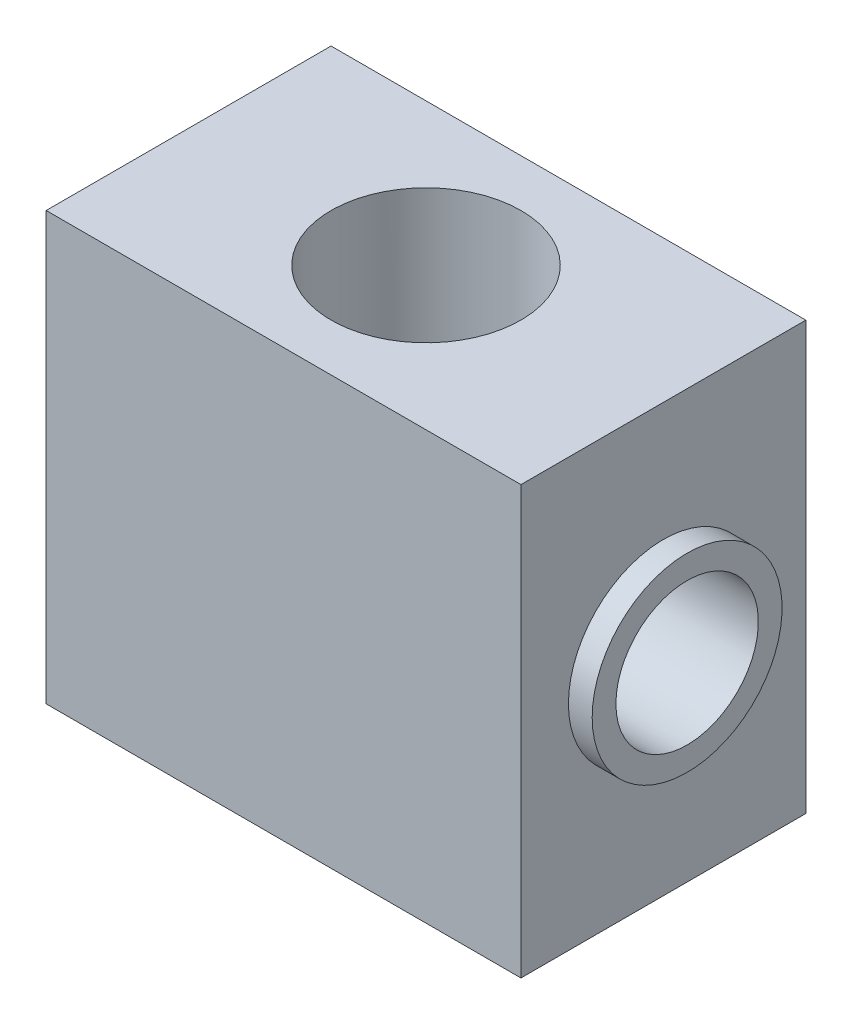
ISO-10303-21;
HEADER;
FILE_DESCRIPTION(('STEP AP214'),'2;1');
FILE_NAME('part.step','',(''),(''),'','','');
FILE_SCHEMA(('AUTOMOTIVE_DESIGN { 1 0 10303 214 1 1 1 1 }'));
ENDSEC;
DATA;
#1=APPLICATION_CONTEXT('core data for automotive mechanical design processes');
#2=APPLICATION_PROTOCOL_DEFINITION('international standard','automotive_design',2000,#1);
#3=PRODUCT_CONTEXT('',#1,'mechanical');
#4=PRODUCT('Part','Part','',(#3));
#5=PRODUCT_RELATED_PRODUCT_CATEGORY('part','',(#4));
#6=PRODUCT_DEFINITION_FORMATION('','',#4);
#7=PRODUCT_DEFINITION_CONTEXT('part definition',#1,'design');
#8=PRODUCT_DEFINITION('design','',#6,#7);
#9=PRODUCT_DEFINITION_SHAPE('','',#8);
#10=(LENGTH_UNIT() NAMED_UNIT(*) SI_UNIT(.MILLI.,.METRE.));
#11=(NAMED_UNIT(*) PLANE_ANGLE_UNIT() SI_UNIT($,.RADIAN.));
#12=(NAMED_UNIT(*) SI_UNIT($,.STERADIAN.) SOLID_ANGLE_UNIT());
#13=UNCERTAINTY_MEASURE_WITH_UNIT(LENGTH_MEASURE(1.E-05),#10,'distance_accuracy_value','');
#14=(GEOMETRIC_REPRESENTATION_CONTEXT(3) GLOBAL_UNCERTAINTY_ASSIGNED_CONTEXT((#13)) GLOBAL_UNIT_ASSIGNED_CONTEXT((#10,
#11,#12)) REPRESENTATION_CONTEXT('',''));
#15=CARTESIAN_POINT('',(0.,0.,0.));
#16=DIRECTION('',(0.,0.,1.));
#17=DIRECTION('',(1.,0.,0.));
#18=AXIS2_PLACEMENT_3D('',#15,#16,#17);
#19=CARTESIAN_POINT('',(-15.875,14.2875,9.525));
#20=DIRECTION('',(1.,0.,0.));
#21=DIRECTION('',(0.,0.,-1.));
#22=AXIS2_PLACEMENT_3D('',#19,#20,#21);
#23=PLANE('',#22);
#24=DIRECTION('',(0.,-1.,0.));
#25=VECTOR('',#24,1.);
#26=CARTESIAN_POINT('',(-15.875,14.2875,-9.525));
#27=LINE('',#26,#25);
#28=CARTESIAN_POINT('',(-15.875,14.2875,-9.525));
#29=VERTEX_POINT('',#28);
#30=CARTESIAN_POINT('',(-15.875,-14.2875,-9.525));
#31=VERTEX_POINT('',#30);
#32=EDGE_CURVE('E102',#29,#31,#27,.T.);
#33=ORIENTED_EDGE('',*,*,#32,.T.);
#34=DIRECTION('',(0.,0.,-1.));
#35=VECTOR('',#34,1.);
#36=CARTESIAN_POINT('',(-15.875,-14.2875,9.525));
#37=LINE('',#36,#35);
#38=CARTESIAN_POINT('',(-15.875,-14.2875,9.525));
#39=VERTEX_POINT('',#38);
#40=EDGE_CURVE('E44',#39,#31,#37,.T.);
#41=ORIENTED_EDGE('',*,*,#40,.F.);
#42=DIRECTION('',(0.,-1.,0.));
#43=VECTOR('',#42,1.);
#44=CARTESIAN_POINT('',(-15.875,14.2875,9.525));
#45=LINE('',#44,#43);
#46=CARTESIAN_POINT('',(-15.875,14.2875,9.525));
#47=VERTEX_POINT('',#46);
#48=EDGE_CURVE('E88',#47,#39,#45,.T.);
#49=ORIENTED_EDGE('',*,*,#48,.F.);
#50=DIRECTION('',(0.,0.,-1.));
#51=VECTOR('',#50,1.);
#52=CARTESIAN_POINT('',(-15.875,14.2875,9.525));
#53=LINE('',#52,#51);
#54=EDGE_CURVE('E98',#47,#29,#53,.T.);
#55=ORIENTED_EDGE('',*,*,#54,.T.);
#56=EDGE_LOOP('',(#33,#41,#49,#55));
#57=FACE_BOUND('',#56,.T.);
#58=CARTESIAN_POINT('',(-15.875,0.,0.));
#59=DIRECTION('',(1.,0.,0.));
#60=DIRECTION('',(0.,0.,-1.));
#61=AXIS2_PLACEMENT_3D('',#58,#59,#60);
#62=CIRCLE('',#61,6.35);
#63=CARTESIAN_POINT('',(-15.875,0.,-6.35));
#64=VERTEX_POINT('',#63);
#65=EDGE_CURVE('E11',#64,#64,#62,.F.);
#66=ORIENTED_EDGE('',*,*,#65,.F.);
#67=EDGE_LOOP('',(#66));
#68=FACE_BOUND('',#67,.T.);
#69=ADVANCED_FACE('F36',(#57,#68),#23,.F.);
#70=CARTESIAN_POINT('',(-15.875,-14.2875,9.525));
#71=DIRECTION('',(0.,1.,0.));
#72=DIRECTION('',(0.,0.,1.));
#73=AXIS2_PLACEMENT_3D('',#70,#71,#72);
#74=PLANE('',#73);
#75=CARTESIAN_POINT('',(0.,-14.2875,0.));
#76=DIRECTION('',(0.,-1.,0.));
#77=DIRECTION('',(0.,0.,-1.));
#78=AXIS2_PLACEMENT_3D('',#75,#76,#77);
#79=CIRCLE('',#78,6.35);
#80=CARTESIAN_POINT('',(0.,-14.2875,-6.35));
#81=VERTEX_POINT('',#80);
#82=EDGE_CURVE('E199',#81,#81,#79,.T.);
#83=ORIENTED_EDGE('',*,*,#82,.F.);
#84=EDGE_LOOP('',(#83));
#85=FACE_BOUND('',#84,.T.);
#86=DIRECTION('',(1.,0.,0.));
#87=VECTOR('',#86,1.);
#88=CARTESIAN_POINT('',(-15.875,-14.2875,-9.525));
#89=LINE('',#88,#87);
#90=CARTESIAN_POINT('',(15.875,-14.2875,-9.525));
#91=VERTEX_POINT('',#90);
#92=EDGE_CURVE('E93',#31,#91,#89,.T.);
#93=ORIENTED_EDGE('',*,*,#92,.T.);
#94=DIRECTION('',(0.,0.,-1.));
#95=VECTOR('',#94,1.);
#96=CARTESIAN_POINT('',(15.875,-14.2875,9.525));
#97=LINE('',#96,#95);
#98=CARTESIAN_POINT('',(15.875,-14.2875,9.525));
#99=VERTEX_POINT('',#98);
#100=EDGE_CURVE('E91',#99,#91,#97,.T.);
#101=ORIENTED_EDGE('',*,*,#100,.F.);
#102=DIRECTION('',(1.,0.,0.));
#103=VECTOR('',#102,1.);
#104=CARTESIAN_POINT('',(-15.875,-14.2875,9.525));
#105=LINE('',#104,#103);
#106=EDGE_CURVE('E83',#39,#99,#105,.T.);
#107=ORIENTED_EDGE('',*,*,#106,.F.);
#108=ORIENTED_EDGE('',*,*,#40,.T.);
#109=EDGE_LOOP('',(#93,#101,#107,#108));
#110=FACE_BOUND('',#109,.T.);
#111=ADVANCED_FACE('F92',(#85,#110),#74,.F.);
#112=CARTESIAN_POINT('',(15.875,14.2875,9.525));
#113=DIRECTION('',(-1.,0.,0.));
#114=DIRECTION('',(0.,0.,1.));
#115=AXIS2_PLACEMENT_3D('',#112,#113,#114);
#116=PLANE('',#115);
#117=CARTESIAN_POINT('',(15.875,0.,0.));
#118=DIRECTION('',(-1.,0.,0.));
#119=DIRECTION('',(0.,0.,1.));
#120=AXIS2_PLACEMENT_3D('',#117,#118,#119);
#121=CIRCLE('',#120,6.35);
#122=CARTESIAN_POINT('',(15.875,0.,6.35));
#123=VERTEX_POINT('',#122);
#124=EDGE_CURVE('E183',#123,#123,#121,.T.);
#125=ORIENTED_EDGE('',*,*,#124,.T.);
#126=EDGE_LOOP('',(#125));
#127=FACE_BOUND('',#126,.T.);
#128=DIRECTION('',(0.,1.,0.));
#129=VECTOR('',#128,1.);
#130=CARTESIAN_POINT('',(15.875,14.2875,-9.525));
#131=LINE('',#130,#129);
#132=CARTESIAN_POINT('',(15.875,14.2875,-9.525));
#133=VERTEX_POINT('',#132);
#134=EDGE_CURVE('E69',#91,#133,#131,.T.);
#135=ORIENTED_EDGE('',*,*,#134,.T.);
#136=DIRECTION('',(0.,0.,-1.));
#137=VECTOR('',#136,1.);
#138=CARTESIAN_POINT('',(15.875,14.2875,9.525));
#139=LINE('',#138,#137);
#140=CARTESIAN_POINT('',(15.875,14.2875,9.525));
#141=VERTEX_POINT('',#140);
#142=EDGE_CURVE('E94',#141,#133,#139,.T.);
#143=ORIENTED_EDGE('',*,*,#142,.F.);
#144=DIRECTION('',(0.,1.,0.));
#145=VECTOR('',#144,1.);
#146=CARTESIAN_POINT('',(15.875,14.2875,9.525));
#147=LINE('',#146,#145);
#148=EDGE_CURVE('E86',#99,#141,#147,.T.);
#149=ORIENTED_EDGE('',*,*,#148,.F.);
#150=ORIENTED_EDGE('',*,*,#100,.T.);
#151=EDGE_LOOP('',(#135,#143,#149,#150));
#152=FACE_BOUND('',#151,.T.);
#153=ADVANCED_FACE('F96',(#127,#152),#116,.F.);
#154=CARTESIAN_POINT('',(-15.875,14.2875,9.525));
#155=DIRECTION('',(0.,-1.,0.));
#156=DIRECTION('',(0.,0.,-1.));
#157=AXIS2_PLACEMENT_3D('',#154,#155,#156);
#158=PLANE('',#157);
#159=CARTESIAN_POINT('',(0.,14.2875,0.));
#160=DIRECTION('',(0.,-1.,0.));
#161=DIRECTION('',(0.,0.,-1.));
#162=AXIS2_PLACEMENT_3D('',#159,#160,#161);
#163=CIRCLE('',#162,6.35);
#164=CARTESIAN_POINT('',(0.,14.2875,-6.35));
#165=VERTEX_POINT('',#164);
#166=EDGE_CURVE('E105',#165,#165,#163,.T.);
#167=ORIENTED_EDGE('',*,*,#166,.T.);
#168=EDGE_LOOP('',(#167));
#169=FACE_BOUND('',#168,.T.);
#170=DIRECTION('',(-1.,0.,0.));
#171=VECTOR('',#170,1.);
#172=CARTESIAN_POINT('',(-15.875,14.2875,-9.525));
#173=LINE('',#172,#171);
#174=EDGE_CURVE('E75',#133,#29,#173,.T.);
#175=ORIENTED_EDGE('',*,*,#174,.T.);
#176=ORIENTED_EDGE('',*,*,#54,.F.);
#177=DIRECTION('',(-1.,0.,0.));
#178=VECTOR('',#177,1.);
#179=CARTESIAN_POINT('',(-15.875,14.2875,9.525));
#180=LINE('',#179,#178);
#181=EDGE_CURVE('E52',#141,#47,#180,.T.);
#182=ORIENTED_EDGE('',*,*,#181,.F.);
#183=ORIENTED_EDGE('',*,*,#142,.T.);
#184=EDGE_LOOP('',(#175,#176,#182,#183));
#185=FACE_BOUND('',#184,.T.);
#186=ADVANCED_FACE('F172',(#169,#185),#158,.F.);
#187=CARTESIAN_POINT('',(-15.875,-14.2875,9.525));
#188=DIRECTION('',(0.,0.,1.));
#189=DIRECTION('',(1.,0.,0.));
#190=AXIS2_PLACEMENT_3D('',#187,#188,#189);
#191=PLANE('',#190);
#192=ORIENTED_EDGE('',*,*,#48,.T.);
#193=ORIENTED_EDGE('',*,*,#106,.T.);
#194=ORIENTED_EDGE('',*,*,#148,.T.);
#195=ORIENTED_EDGE('',*,*,#181,.T.);
#196=EDGE_LOOP('',(#192,#193,#194,#195));
#197=FACE_BOUND('',#196,.T.);
#198=ADVANCED_FACE('F84',(#197),#191,.T.);
#199=CARTESIAN_POINT('',(-15.875,-14.2875,-9.525));
#200=DIRECTION('',(0.,0.,1.));
#201=DIRECTION('',(1.,0.,0.));
#202=AXIS2_PLACEMENT_3D('',#199,#200,#201);
#203=PLANE('',#202);
#204=ORIENTED_EDGE('',*,*,#32,.F.);
#205=ORIENTED_EDGE('',*,*,#174,.F.);
#206=ORIENTED_EDGE('',*,*,#134,.F.);
#207=ORIENTED_EDGE('',*,*,#92,.F.);
#208=EDGE_LOOP('',(#204,#205,#206,#207));
#209=FACE_BOUND('',#208,.T.);
#210=ADVANCED_FACE('F164',(#209),#203,.F.);
#211=CARTESIAN_POINT('',(0.,14.2875,0.));
#212=DIRECTION('',(0.,-1.,0.));
#213=DIRECTION('',(0.,0.,-1.));
#214=AXIS2_PLACEMENT_3D('',#211,#212,#213);
#215=CYLINDRICAL_SURFACE('',#214,6.35);
#216=CARTESIAN_POINT('',(4.20013020631504,0.,4.7625));
#217=CARTESIAN_POINT('',(4.20011953809576,-0.111186421407597,4.76250532818277));
#218=CARTESIAN_POINT('',(4.20456450548773,-0.222335131814892,4.75859917817128));
#219=CARTESIAN_POINT('',(4.22203936962768,-0.44345601832519,4.74310315019688));
#220=CARTESIAN_POINT('',(4.2350721306406,-0.553427789446174,4.73151070863669));
#221=CARTESIAN_POINT('',(4.26900687788614,-0.771330646695615,4.70091422775085));
#222=CARTESIAN_POINT('',(4.28992617726975,-0.879256690384536,4.68189387877689));
#223=CARTESIAN_POINT('',(4.33855272715723,-1.09210659621938,4.63686954824563));
#224=CARTESIAN_POINT('',(4.3662641495093,-1.19702856880627,4.61086127362641));
#225=CARTESIAN_POINT('',(4.45688040191758,-1.50346339809695,4.52389497913693));
#226=CARTESIAN_POINT('',(4.52785389827898,-1.69997562692512,4.45350293503279));
#227=CARTESIAN_POINT('',(4.68270372967542,-2.0775893020258,4.29038797134807));
#228=CARTESIAN_POINT('',(4.7665785048038,-2.25869260730061,4.19766775072435));
#229=CARTESIAN_POINT('',(4.95862336668685,-2.64193714688385,3.97002711682411));
#230=CARTESIAN_POINT('',(5.06820262225417,-2.8405401206498,3.83033545814133));
#231=CARTESIAN_POINT('',(5.28706206248463,-3.21479897118331,3.52211266889734));
#232=CARTESIAN_POINT('',(5.39634156245027,-3.39042037387456,3.35353906847427));
#233=CARTESIAN_POINT('',(5.56479698055828,-3.65122050637665,3.06131721347289));
#234=CARTESIAN_POINT('',(5.62662833585399,-3.74460908580083,2.94643201752262));
#235=CARTESIAN_POINT('',(5.7457293197271,-3.92129879596277,2.70683972092511));
#236=CARTESIAN_POINT('',(5.80299792145989,-4.00459765819876,2.5821304218581));
#237=CARTESIAN_POINT('',(5.9112460807229,-4.15990707700906,2.32363022931997));
#238=CARTESIAN_POINT('',(5.96223744054386,-4.23193888880663,2.18985713528875));
#239=CARTESIAN_POINT('',(6.0564698619,-4.36369664478768,1.91388198427301));
#240=CARTESIAN_POINT('',(6.09971502177246,-4.42342909879662,1.77168443778689));
#241=CARTESIAN_POINT('',(6.19228834306466,-4.55037683247,1.42208167134097));
#242=CARTESIAN_POINT('',(6.23726509319455,-4.61121835692386,1.21111732817645));
#243=CARTESIAN_POINT('',(6.30574215805104,-4.7034290276739,0.779603436911781));
#244=CARTESIAN_POINT('',(6.32926113114924,-4.73482377975149,0.559062391300457));
#245=CARTESIAN_POINT('',(6.35289761422912,-4.76637485366974,0.113878681937143));
#246=CARTESIAN_POINT('',(6.35295431750103,-4.76645000511236,-0.110773130519206));
#247=CARTESIAN_POINT('',(6.32949703102242,-4.73513918851885,-0.556630652552049));
#248=CARTESIAN_POINT('',(6.30597758276731,-4.70374593471206,-0.777835552032051));
#249=CARTESIAN_POINT('',(6.23860092463707,-4.61301727957836,-1.20297279897302));
#250=CARTESIAN_POINT('',(6.19546786487467,-4.55467571207698,-1.40723724339497));
#251=CARTESIAN_POINT('',(6.09226271662649,-4.41326428781399,-1.80238534823575));
#252=CARTESIAN_POINT('',(6.03218693475176,-4.33018903907145,-1.99326607976246));
#253=CARTESIAN_POINT('',(5.89156193328833,-4.13216689572131,-2.37876501110247));
#254=CARTESIAN_POINT('',(5.8095002345112,-4.01474300200095,-2.57155002572095));
#255=CARTESIAN_POINT('',(5.63438223787399,-3.75687658634158,-2.93549583680262));
#256=CARTESIAN_POINT('',(5.54131658988045,-3.61641444883896,-3.10663798392737));
#257=CARTESIAN_POINT('',(5.33060496833151,-3.28538856157818,-3.4578587708297));
#258=CARTESIAN_POINT('',(5.21172505327229,-3.09040452230774,-3.63307252959164));
#259=CARTESIAN_POINT('',(5.03499881699487,-2.77802581444316,-3.8705423403053));
#260=CARTESIAN_POINT('',(4.97631700019414,-2.67050395671561,-3.94551541065803));
#261=CARTESIAN_POINT('',(4.8609815056579,-2.44887753821896,-4.08676683745602));
#262=CARTESIAN_POINT('',(4.80432737690824,-2.33477445622897,-4.1530471362645));
#263=CARTESIAN_POINT('',(4.66153134894648,-2.02895557137118,-4.31394545847195));
#264=CARTESIAN_POINT('',(4.57827767321152,-1.83203549582695,-4.40145884780356));
#265=CARTESIAN_POINT('',(4.43028766387843,-1.42217341093655,-4.55039851598353));
#266=CARTESIAN_POINT('',(4.36550959205387,-1.2092689100013,-4.61188374978561));
#267=CARTESIAN_POINT('',(4.27482237642154,-0.813797574542095,-4.69589922558811));
#268=CARTESIAN_POINT('',(4.2437541642742,-0.63358114459821,-4.72373494071945));
#269=CARTESIAN_POINT('',(4.20482964993666,-0.26874576538667,-4.75842891481428));
#270=CARTESIAN_POINT('',(4.19694365066358,-0.0841327543359287,-4.76531401252016));
#271=CARTESIAN_POINT('',(4.2056964481699,0.284096895184296,-4.75758677217096));
#272=CARTESIAN_POINT('',(4.22234427194311,0.467713141950669,-4.74296652142505));
#273=CARTESIAN_POINT('',(4.27739752073682,0.828911758928113,-4.69336694467554));
#274=CARTESIAN_POINT('',(4.31584008015931,1.00648328117932,-4.65835286838308));
#275=CARTESIAN_POINT('',(4.42683729033694,1.41714942809646,-4.55338460601146));
#276=CARTESIAN_POINT('',(4.50677425640583,1.6461487693098,-4.47525785727432));
#277=CARTESIAN_POINT('',(4.63991021991195,1.97426139953277,-4.33565615732389));
#278=CARTESIAN_POINT('',(4.68656221896427,2.08119491774683,-4.28530809342367));
#279=CARTESIAN_POINT('',(4.78293813436869,2.28996762139791,-4.17746704607447));
#280=CARTESIAN_POINT('',(4.83266177306125,2.39180726579179,-4.1199747079552));
#281=CARTESIAN_POINT('',(4.98812615153396,2.69661248241161,-3.93292762354836));
#282=CARTESIAN_POINT('',(5.09688932266039,2.89121609174662,-3.79207620535673));
#283=CARTESIAN_POINT('',(5.31331307808268,3.25759996727644,-3.48237814055288));
#284=CARTESIAN_POINT('',(5.42097309960134,3.42936907192705,-3.31351789315898));
#285=CARTESIAN_POINT('',(5.58729468261059,3.6853962786035,-3.02009775640389));
#286=CARTESIAN_POINT('',(5.64867900066902,3.77764223786089,-2.90397323405847));
#287=CARTESIAN_POINT('',(5.76668806473582,3.95192632981357,-2.66194041583814));
#288=CARTESIAN_POINT('',(5.82331172939648,4.03396214537084,-2.53602990957992));
#289=CARTESIAN_POINT('',(5.93008584103535,4.18662052681659,-2.27517011196718));
#290=CARTESIAN_POINT('',(5.98024718545062,4.25726235850378,-2.14023663577307));
#291=CARTESIAN_POINT('',(6.07262368538497,4.38607734520554,-1.862050679469));
#292=CARTESIAN_POINT('',(6.11484312793146,4.44425722952752,-1.71880274245795));
#293=CARTESIAN_POINT('',(6.20451630368889,4.56698263300261,-1.36774808361083));
#294=CARTESIAN_POINT('',(6.24760807326602,4.62518728363214,-1.15652041032548));
#295=CARTESIAN_POINT('',(6.31223927466902,4.71212444937983,-0.725030721666342));
#296=CARTESIAN_POINT('',(6.33379797527245,4.74088331451683,-0.504776967342904));
#297=CARTESIAN_POINT('',(6.35360215024369,4.76731036082886,-0.0608007551086788));
#298=CARTESIAN_POINT('',(6.35179289781839,4.76490555792014,0.162928619355446));
#299=CARTESIAN_POINT('',(6.32488048738505,4.72897000008472,0.606455490129809));
#300=CARTESIAN_POINT('',(6.29977112384625,4.69543095315763,0.826251923081566));
#301=CARTESIAN_POINT('',(6.22945764617392,4.60065424513094,1.24943174497346));
#302=CARTESIAN_POINT('',(6.18485804728499,4.54024894495676,1.45310637380629));
#303=CARTESIAN_POINT('',(6.07894176373197,4.39487337110977,1.8467745664094));
#304=CARTESIAN_POINT('',(6.01762150333768,4.30989784283406,2.03676519284343));
#305=CARTESIAN_POINT('',(5.87430879455941,4.10756585394743,2.4210902699635));
#306=CARTESIAN_POINT('',(5.79076148883794,3.98763172658527,2.61347878727697));
#307=CARTESIAN_POINT('',(5.61294503234293,3.72470562365255,2.97628666156181));
#308=CARTESIAN_POINT('',(5.51866605103407,3.5816924560889,3.14668556558624));
#309=CARTESIAN_POINT('',(5.30560332844169,3.24480348935136,3.4960922146136));
#310=CARTESIAN_POINT('',(5.1856614980354,3.04646256403674,3.67013456888228));
#311=CARTESIAN_POINT('',(5.00800532024307,2.72885619017294,3.90539577865764));
#312=CARTESIAN_POINT('',(4.94912612171604,2.61956264924592,3.97955456378794));
#313=CARTESIAN_POINT('',(4.83368255810497,2.39431515772432,4.1190042180021));
#314=CARTESIAN_POINT('',(4.77711759773768,2.27836293859891,4.18429737770742));
#315=CARTESIAN_POINT('',(4.63708715636166,1.97211747298915,4.34007035191432));
#316=CARTESIAN_POINT('',(4.55655929121339,1.77695820433637,4.42383314796973));
#317=CARTESIAN_POINT('',(4.41428223500267,1.37131503495296,4.56582768375612));
#318=CARTESIAN_POINT('',(4.3524833126639,1.16087359061296,4.62412722160411));
#319=CARTESIAN_POINT('',(4.27140056615424,0.791258246769859,4.69890760336641));
#320=CARTESIAN_POINT('',(4.24496505652712,0.635130715525931,4.72263653448936));
#321=CARTESIAN_POINT('',(4.2093431933355,0.319307943541469,4.75442376689446));
#322=CARTESIAN_POINT('',(4.20014552121599,0.159615113580113,4.76249235105792));
#323=CARTESIAN_POINT('',(4.20013020631504,0.,4.7625));
#324=B_SPLINE_CURVE_WITH_KNOTS('',3,(#216,#217,#218,#219,#220,#221,#222,#223,#224,#225,#226,
#227,#228,#229,#230,#231,#232,#233,#234,#235,#236,#237,#238,#239,#240,#241,#242,#243,#244,#245,
#246,#247,#248,#249,#250,#251,#252,#253,#254,#255,#256,#257,#258,#259,#260,#261,#262,#263,#264,
#265,#266,#267,#268,#269,#270,#271,#272,#273,#274,#275,#276,#277,#278,#279,#280,#281,#282,#283,
#284,#285,#286,#287,#288,#289,#290,#291,#292,#293,#294,#295,#296,#297,#298,#299,#300,#301,#302,
#303,#304,#305,#306,#307,#308,#309,#310,#311,#312,#313,#314,#315,#316,#317,#318,#319,#320,#321,
#322,#323),.UNSPECIFIED.,.T.,.F.,(4,2,2,2,2,2,2,2,2,2,2,2,2,2,2,2,2,2,2,2,2,2,2,2,2,2,2,2,2,2,2,
2,2,2,2,2,2,2,2,2,2,2,2,2,2,2,2,2,2,2,2,2,2,4),(0.,0.333341125485964,0.666793485700833,
1.00098217018904,1.3353766362424,1.99404836638534,2.65264051837609,3.44917214298601,
4.24688525230261,4.72763995046396,5.20850253831737,5.6884467469198,6.16813627312061,
6.83742048930541,7.50612218063811,8.17655692235089,8.84714692335394,9.49476946141088,
10.1425332856933,10.8604350124544,11.5789511894263,12.4388123829923,12.869318695604,
13.2997286489051,13.9904429084842,14.6795841875462,15.2321408336656,15.7839893296708,
16.3360409239405,16.8890359561818,17.6490150530093,18.0299816062073,18.4109137723466,
19.199347122163,19.9881644534837,20.4690827237876,20.9501099376992,21.4303150693847,
21.9102602384737,22.5770676300233,23.2432777957192,23.9110484808084,24.578997064673,
25.2275549788184,25.876251696644,26.5984323423953,27.3212799332427,28.1871238592066,
28.6205951364787,29.053954203315,29.7330883362906,30.4104030259773,30.8892497411783,
31.3677819300174),.UNSPECIFIED.);
#325=CARTESIAN_POINT('',(4.20013020631504,0.,4.7625));
#326=VERTEX_POINT('',#325);
#327=EDGE_CURVE('E119',#326,#326,#324,.T.);
#328=ORIENTED_EDGE('',*,*,#327,.T.);
#329=EDGE_LOOP('',(#328));
#330=FACE_BOUND('',#329,.T.);
#331=CARTESIAN_POINT('',(-4.20013020631504,0.,4.7625));
#332=CARTESIAN_POINT('',(-4.20011953809576,0.111186421407597,4.76250532818277));
#333=CARTESIAN_POINT('',(-4.20456450548773,0.222335131814892,4.75859917817128));
#334=CARTESIAN_POINT('',(-4.22203936962768,0.44345601832519,4.74310315019688));
#335=CARTESIAN_POINT('',(-4.2350721306406,0.553427789446174,4.73151070863669));
#336=CARTESIAN_POINT('',(-4.26900687788614,0.771330646695615,4.70091422775085));
#337=CARTESIAN_POINT('',(-4.28992617726975,0.879256690384536,4.68189387877689));
#338=CARTESIAN_POINT('',(-4.33855272715723,1.09210659621938,4.63686954824563));
#339=CARTESIAN_POINT('',(-4.3662641495093,1.19702856880627,4.61086127362641));
#340=CARTESIAN_POINT('',(-4.45688040191758,1.50346339809695,4.52389497913693));
#341=CARTESIAN_POINT('',(-4.52785389827898,1.69997562692512,4.45350293503279));
#342=CARTESIAN_POINT('',(-4.68270372967542,2.0775893020258,4.29038797134807));
#343=CARTESIAN_POINT('',(-4.7665785048038,2.25869260730061,4.19766775072435));
#344=CARTESIAN_POINT('',(-4.95862336668685,2.64193714688385,3.97002711682411));
#345=CARTESIAN_POINT('',(-5.06820262225417,2.8405401206498,3.83033545814133));
#346=CARTESIAN_POINT('',(-5.28706206248463,3.21479897118331,3.52211266889734));
#347=CARTESIAN_POINT('',(-5.39634156245027,3.39042037387456,3.35353906847427));
#348=CARTESIAN_POINT('',(-5.56479698055828,3.65122050637665,3.06131721347289));
#349=CARTESIAN_POINT('',(-5.62662833585399,3.74460908580083,2.94643201752262));
#350=CARTESIAN_POINT('',(-5.7457293197271,3.92129879596277,2.70683972092511));
#351=CARTESIAN_POINT('',(-5.80299792145989,4.00459765819876,2.5821304218581));
#352=CARTESIAN_POINT('',(-5.9112460807229,4.15990707700906,2.32363022931997));
#353=CARTESIAN_POINT('',(-5.96223744054386,4.23193888880663,2.18985713528875));
#354=CARTESIAN_POINT('',(-6.0564698619,4.36369664478768,1.91388198427301));
#355=CARTESIAN_POINT('',(-6.09971502177246,4.42342909879662,1.77168443778689));
#356=CARTESIAN_POINT('',(-6.19228834306466,4.55037683247,1.42208167134097));
#357=CARTESIAN_POINT('',(-6.23726509319455,4.61121835692386,1.21111732817645));
#358=CARTESIAN_POINT('',(-6.30574215805104,4.7034290276739,0.779603436911781));
#359=CARTESIAN_POINT('',(-6.32926113114924,4.73482377975149,0.559062391300457));
#360=CARTESIAN_POINT('',(-6.35289761422912,4.76637485366974,0.113878681937143));
#361=CARTESIAN_POINT('',(-6.35295431750103,4.76645000511236,-0.110773130519206));
#362=CARTESIAN_POINT('',(-6.32949703102242,4.73513918851885,-0.556630652552049));
#363=CARTESIAN_POINT('',(-6.30597758276731,4.70374593471206,-0.777835552032051));
#364=CARTESIAN_POINT('',(-6.23860092463707,4.61301727957836,-1.20297279897302));
#365=CARTESIAN_POINT('',(-6.19546786487467,4.55467571207698,-1.40723724339497));
#366=CARTESIAN_POINT('',(-6.09226271662649,4.41326428781399,-1.80238534823575));
#367=CARTESIAN_POINT('',(-6.03218693475176,4.33018903907145,-1.99326607976246));
#368=CARTESIAN_POINT('',(-5.89156193328833,4.13216689572131,-2.37876501110247));
#369=CARTESIAN_POINT('',(-5.8095002345112,4.01474300200095,-2.57155002572095));
#370=CARTESIAN_POINT('',(-5.63438223787399,3.75687658634158,-2.93549583680262));
#371=CARTESIAN_POINT('',(-5.54131658988045,3.61641444883896,-3.10663798392737));
#372=CARTESIAN_POINT('',(-5.33060496833151,3.28538856157818,-3.4578587708297));
#373=CARTESIAN_POINT('',(-5.21172505327229,3.09040452230774,-3.63307252959164));
#374=CARTESIAN_POINT('',(-5.03499881699487,2.77802581444316,-3.8705423403053));
#375=CARTESIAN_POINT('',(-4.97631700019414,2.67050395671561,-3.94551541065803));
#376=CARTESIAN_POINT('',(-4.8609815056579,2.44887753821896,-4.08676683745602));
#377=CARTESIAN_POINT('',(-4.80432737690824,2.33477445622897,-4.1530471362645));
#378=CARTESIAN_POINT('',(-4.66153134894648,2.02895557137118,-4.31394545847195));
#379=CARTESIAN_POINT('',(-4.57827767321152,1.83203549582695,-4.40145884780356));
#380=CARTESIAN_POINT('',(-4.43028766387843,1.42217341093655,-4.55039851598353));
#381=CARTESIAN_POINT('',(-4.36550959205387,1.2092689100013,-4.61188374978561));
#382=CARTESIAN_POINT('',(-4.27482237642154,0.813797574542095,-4.69589922558811));
#383=CARTESIAN_POINT('',(-4.2437541642742,0.63358114459821,-4.72373494071945));
#384=CARTESIAN_POINT('',(-4.20482964993666,0.26874576538667,-4.75842891481428));
#385=CARTESIAN_POINT('',(-4.19694365066358,0.0841327543359287,-4.76531401252016));
#386=CARTESIAN_POINT('',(-4.2056964481699,-0.284096895184296,-4.75758677217096));
#387=CARTESIAN_POINT('',(-4.22234427194311,-0.467713141950669,-4.74296652142505));
#388=CARTESIAN_POINT('',(-4.27739752073682,-0.828911758928113,-4.69336694467554));
#389=CARTESIAN_POINT('',(-4.31584008015931,-1.00648328117932,-4.65835286838308));
#390=CARTESIAN_POINT('',(-4.42683729033694,-1.41714942809646,-4.55338460601146));
#391=CARTESIAN_POINT('',(-4.50677425640583,-1.6461487693098,-4.47525785727432));
#392=CARTESIAN_POINT('',(-4.63991021991195,-1.97426139953277,-4.33565615732389));
#393=CARTESIAN_POINT('',(-4.68656221896427,-2.08119491774683,-4.28530809342367));
#394=CARTESIAN_POINT('',(-4.78293813436869,-2.28996762139791,-4.17746704607447));
#395=CARTESIAN_POINT('',(-4.83266177306125,-2.39180726579179,-4.1199747079552));
#396=CARTESIAN_POINT('',(-4.98812615153396,-2.69661248241161,-3.93292762354836));
#397=CARTESIAN_POINT('',(-5.09688932266039,-2.89121609174662,-3.79207620535673));
#398=CARTESIAN_POINT('',(-5.31331307808268,-3.25759996727644,-3.48237814055288));
#399=CARTESIAN_POINT('',(-5.42097309960134,-3.42936907192705,-3.31351789315898));
#400=CARTESIAN_POINT('',(-5.58729468261059,-3.6853962786035,-3.02009775640389));
#401=CARTESIAN_POINT('',(-5.64867900066902,-3.77764223786089,-2.90397323405847));
#402=CARTESIAN_POINT('',(-5.76668806473582,-3.95192632981357,-2.66194041583814));
#403=CARTESIAN_POINT('',(-5.82331172939648,-4.03396214537084,-2.53602990957992));
#404=CARTESIAN_POINT('',(-5.93008584103535,-4.18662052681659,-2.27517011196718));
#405=CARTESIAN_POINT('',(-5.98024718545062,-4.25726235850378,-2.14023663577307));
#406=CARTESIAN_POINT('',(-6.07262368538497,-4.38607734520554,-1.862050679469));
#407=CARTESIAN_POINT('',(-6.11484312793146,-4.44425722952752,-1.71880274245795));
#408=CARTESIAN_POINT('',(-6.20451630368889,-4.56698263300261,-1.36774808361083));
#409=CARTESIAN_POINT('',(-6.24760807326602,-4.62518728363214,-1.15652041032548));
#410=CARTESIAN_POINT('',(-6.31223927466902,-4.71212444937983,-0.725030721666342));
#411=CARTESIAN_POINT('',(-6.33379797527245,-4.74088331451683,-0.504776967342904));
#412=CARTESIAN_POINT('',(-6.35360215024369,-4.76731036082886,-0.0608007551086788));
#413=CARTESIAN_POINT('',(-6.35179289781839,-4.76490555792014,0.162928619355446));
#414=CARTESIAN_POINT('',(-6.32488048738505,-4.72897000008472,0.606455490129809));
#415=CARTESIAN_POINT('',(-6.29977112384625,-4.69543095315763,0.826251923081566));
#416=CARTESIAN_POINT('',(-6.22945764617392,-4.60065424513094,1.24943174497346));
#417=CARTESIAN_POINT('',(-6.18485804728499,-4.54024894495676,1.45310637380629));
#418=CARTESIAN_POINT('',(-6.07894176373197,-4.39487337110977,1.8467745664094));
#419=CARTESIAN_POINT('',(-6.01762150333768,-4.30989784283406,2.03676519284343));
#420=CARTESIAN_POINT('',(-5.87430879455941,-4.10756585394743,2.4210902699635));
#421=CARTESIAN_POINT('',(-5.79076148883794,-3.98763172658527,2.61347878727697));
#422=CARTESIAN_POINT('',(-5.61294503234293,-3.72470562365255,2.97628666156181));
#423=CARTESIAN_POINT('',(-5.51866605103407,-3.5816924560889,3.14668556558624));
#424=CARTESIAN_POINT('',(-5.30560332844169,-3.24480348935136,3.4960922146136));
#425=CARTESIAN_POINT('',(-5.1856614980354,-3.04646256403674,3.67013456888228));
#426=CARTESIAN_POINT('',(-5.00800532024307,-2.72885619017294,3.90539577865764));
#427=CARTESIAN_POINT('',(-4.94912612171604,-2.61956264924592,3.97955456378794));
#428=CARTESIAN_POINT('',(-4.83368255810497,-2.39431515772432,4.1190042180021));
#429=CARTESIAN_POINT('',(-4.77711759773768,-2.27836293859891,4.18429737770742));
#430=CARTESIAN_POINT('',(-4.63708715636166,-1.97211747298915,4.34007035191432));
#431=CARTESIAN_POINT('',(-4.55655929121339,-1.77695820433637,4.42383314796973));
#432=CARTESIAN_POINT('',(-4.41428223500267,-1.37131503495296,4.56582768375612));
#433=CARTESIAN_POINT('',(-4.3524833126639,-1.16087359061296,4.62412722160411));
#434=CARTESIAN_POINT('',(-4.27140056615424,-0.791258246769859,4.69890760336641));
#435=CARTESIAN_POINT('',(-4.24496505652712,-0.635130715525931,4.72263653448936));
#436=CARTESIAN_POINT('',(-4.2093431933355,-0.319307943541469,4.75442376689446));
#437=CARTESIAN_POINT('',(-4.20014552121599,-0.159615113580113,4.76249235105792));
#438=CARTESIAN_POINT('',(-4.20013020631504,0.,4.7625));
#439=B_SPLINE_CURVE_WITH_KNOTS('',3,(#331,#332,#333,#334,#335,#336,#337,#338,#339,#340,#341,
#342,#343,#344,#345,#346,#347,#348,#349,#350,#351,#352,#353,#354,#355,#356,#357,#358,#359,#360,
#361,#362,#363,#364,#365,#366,#367,#368,#369,#370,#371,#372,#373,#374,#375,#376,#377,#378,#379,
#380,#381,#382,#383,#384,#385,#386,#387,#388,#389,#390,#391,#392,#393,#394,#395,#396,#397,#398,
#399,#400,#401,#402,#403,#404,#405,#406,#407,#408,#409,#410,#411,#412,#413,#414,#415,#416,#417,
#418,#419,#420,#421,#422,#423,#424,#425,#426,#427,#428,#429,#430,#431,#432,#433,#434,#435,#436,
#437,#438),.UNSPECIFIED.,.T.,.F.,(4,2,2,2,2,2,2,2,2,2,2,2,2,2,2,2,2,2,2,2,2,2,2,2,2,2,2,2,2,2,2,
2,2,2,2,2,2,2,2,2,2,2,2,2,2,2,2,2,2,2,2,2,2,4),(0.,0.333341125485964,0.666793485700833,
1.00098217018904,1.3353766362424,1.99404836638534,2.65264051837609,3.44917214298601,
4.24688525230261,4.72763995046396,5.20850253831737,5.6884467469198,6.16813627312061,
6.83742048930541,7.50612218063811,8.17655692235089,8.84714692335394,9.49476946141088,
10.1425332856933,10.8604350124544,11.5789511894263,12.4388123829923,12.869318695604,
13.2997286489051,13.9904429084842,14.6795841875462,15.2321408336656,15.7839893296708,
16.3360409239405,16.8890359561818,17.6490150530093,18.0299816062073,18.4109137723466,
19.199347122163,19.9881644534837,20.4690827237876,20.9501099376992,21.4303150693847,
21.9102602384737,22.5770676300233,23.2432777957192,23.9110484808084,24.578997064673,
25.2275549788184,25.876251696644,26.5984323423953,27.3212799332427,28.1871238592066,
28.6205951364787,29.053954203315,29.7330883362906,30.4104030259773,30.8892497411783,
31.3677819300174),.UNSPECIFIED.);
#440=CARTESIAN_POINT('',(-4.20013020631504,0.,4.7625));
#441=VERTEX_POINT('',#440);
#442=EDGE_CURVE('E112',#441,#441,#439,.T.);
#443=ORIENTED_EDGE('',*,*,#442,.T.);
#444=EDGE_LOOP('',(#443));
#445=FACE_BOUND('',#444,.T.);
#446=ORIENTED_EDGE('',*,*,#166,.F.);
#447=EDGE_LOOP('',(#446));
#448=FACE_BOUND('',#447,.T.);
#449=ORIENTED_EDGE('',*,*,#82,.T.);
#450=EDGE_LOOP('',(#449));
#451=FACE_BOUND('',#450,.T.);
#452=ADVANCED_FACE('F124',(#330,#445,#448,#451),#215,.F.);
#453=CARTESIAN_POINT('',(15.875,0.,0.));
#454=DIRECTION('',(-1.,0.,0.));
#455=DIRECTION('',(0.,0.,1.));
#456=AXIS2_PLACEMENT_3D('',#453,#454,#455);
#457=CYLINDRICAL_SURFACE('',#456,4.7625);
#458=ORIENTED_EDGE('',*,*,#442,.F.);
#459=EDGE_LOOP('',(#458));
#460=FACE_BOUND('',#459,.T.);
#461=CARTESIAN_POINT('',(-17.4625,0.,0.));
#462=DIRECTION('',(-1.,0.,0.));
#463=DIRECTION('',(0.,0.,1.));
#464=AXIS2_PLACEMENT_3D('',#461,#462,#463);
#465=CIRCLE('',#464,4.7625);
#466=CARTESIAN_POINT('',(-17.4625,0.,4.7625));
#467=VERTEX_POINT('',#466);
#468=EDGE_CURVE('E189',#467,#467,#465,.T.);
#469=ORIENTED_EDGE('',*,*,#468,.T.);
#470=EDGE_LOOP('',(#469));
#471=FACE_BOUND('',#470,.T.);
#472=ADVANCED_FACE('F132',(#460,#471),#457,.F.);
#473=ORIENTED_EDGE('',*,*,#327,.F.);
#474=EDGE_LOOP('',(#473));
#475=FACE_BOUND('',#474,.T.);
#476=CARTESIAN_POINT('',(17.4625,0.,0.));
#477=DIRECTION('',(-1.,0.,0.));
#478=DIRECTION('',(0.,0.,1.));
#479=AXIS2_PLACEMENT_3D('',#476,#477,#478);
#480=CIRCLE('',#479,4.7625);
#481=CARTESIAN_POINT('',(17.4625,0.,4.7625));
#482=VERTEX_POINT('',#481);
#483=EDGE_CURVE('E186',#482,#482,#480,.T.);
#484=ORIENTED_EDGE('',*,*,#483,.F.);
#485=EDGE_LOOP('',(#484));
#486=FACE_BOUND('',#485,.T.);
#487=ADVANCED_FACE('F127',(#475,#486),#457,.F.);
#488=CARTESIAN_POINT('',(-17.4625,0.,0.));
#489=DIRECTION('',(-1.,0.,0.));
#490=DIRECTION('',(0.,0.,1.));
#491=AXIS2_PLACEMENT_3D('',#488,#489,#490);
#492=PLANE('',#491);
#493=CARTESIAN_POINT('',(-17.4625,0.,0.));
#494=DIRECTION('',(-1.,0.,0.));
#495=DIRECTION('',(0.,0.,1.));
#496=AXIS2_PLACEMENT_3D('',#493,#494,#495);
#497=CIRCLE('',#496,6.35);
#498=CARTESIAN_POINT('',(-17.4625,0.,6.35));
#499=VERTEX_POINT('',#498);
#500=EDGE_CURVE('E120',#499,#499,#497,.T.);
#501=ORIENTED_EDGE('',*,*,#500,.T.);
#502=EDGE_LOOP('',(#501));
#503=FACE_BOUND('',#502,.T.);
#504=ORIENTED_EDGE('',*,*,#468,.F.);
#505=EDGE_LOOP('',(#504));
#506=FACE_BOUND('',#505,.T.);
#507=ADVANCED_FACE('F131',(#503,#506),#492,.T.);
#508=CARTESIAN_POINT('',(-17.4625,0.,0.));
#509=DIRECTION('',(1.,0.,0.));
#510=DIRECTION('',(0.,0.,-1.));
#511=AXIS2_PLACEMENT_3D('',#508,#509,#510);
#512=CYLINDRICAL_SURFACE('',#511,6.35);
#513=ORIENTED_EDGE('',*,*,#500,.F.);
#514=EDGE_LOOP('',(#513));
#515=FACE_BOUND('',#514,.T.);
#516=ORIENTED_EDGE('',*,*,#65,.T.);
#517=EDGE_LOOP('',(#516));
#518=FACE_BOUND('',#517,.T.);
#519=ADVANCED_FACE('F134',(#515,#518),#512,.T.);
#520=CARTESIAN_POINT('',(17.4625,0.,0.));
#521=DIRECTION('',(-1.,0.,0.));
#522=DIRECTION('',(0.,0.,1.));
#523=AXIS2_PLACEMENT_3D('',#520,#521,#522);
#524=CYLINDRICAL_SURFACE('',#523,6.35);
#525=CARTESIAN_POINT('',(17.4625,0.,0.));
#526=DIRECTION('',(-1.,0.,0.));
#527=DIRECTION('',(0.,0.,1.));
#528=AXIS2_PLACEMENT_3D('',#525,#526,#527);
#529=CIRCLE('',#528,6.35);
#530=CARTESIAN_POINT('',(17.4625,0.,6.35));
#531=VERTEX_POINT('',#530);
#532=EDGE_CURVE('E185',#531,#531,#529,.T.);
#533=ORIENTED_EDGE('',*,*,#532,.T.);
#534=EDGE_LOOP('',(#533));
#535=FACE_BOUND('',#534,.T.);
#536=ORIENTED_EDGE('',*,*,#124,.F.);
#537=EDGE_LOOP('',(#536));
#538=FACE_BOUND('',#537,.T.);
#539=ADVANCED_FACE('F138',(#535,#538),#524,.T.);
#540=CARTESIAN_POINT('',(17.4625,0.,0.));
#541=DIRECTION('',(1.,0.,0.));
#542=DIRECTION('',(0.,0.,1.));
#543=AXIS2_PLACEMENT_3D('',#540,#541,#542);
#544=PLANE('',#543);
#545=ORIENTED_EDGE('',*,*,#483,.T.);
#546=EDGE_LOOP('',(#545));
#547=FACE_BOUND('',#546,.T.);
#548=ORIENTED_EDGE('',*,*,#532,.F.);
#549=EDGE_LOOP('',(#548));
#550=FACE_BOUND('',#549,.T.);
#551=ADVANCED_FACE('F145',(#547,#550),#544,.T.);
#552=CLOSED_SHELL('',(#69,#111,#153,#186,#198,#210,#452,#472,#487,#507,#519,#539,#551));
#553=MANIFOLD_SOLID_BREP('B2',#552);
#554=ADVANCED_BREP_SHAPE_REPRESENTATION('',(#18,#553),#14);
#555=SHAPE_DEFINITION_REPRESENTATION(#9,#554);
ENDSEC;
END-ISO-10303-21;
